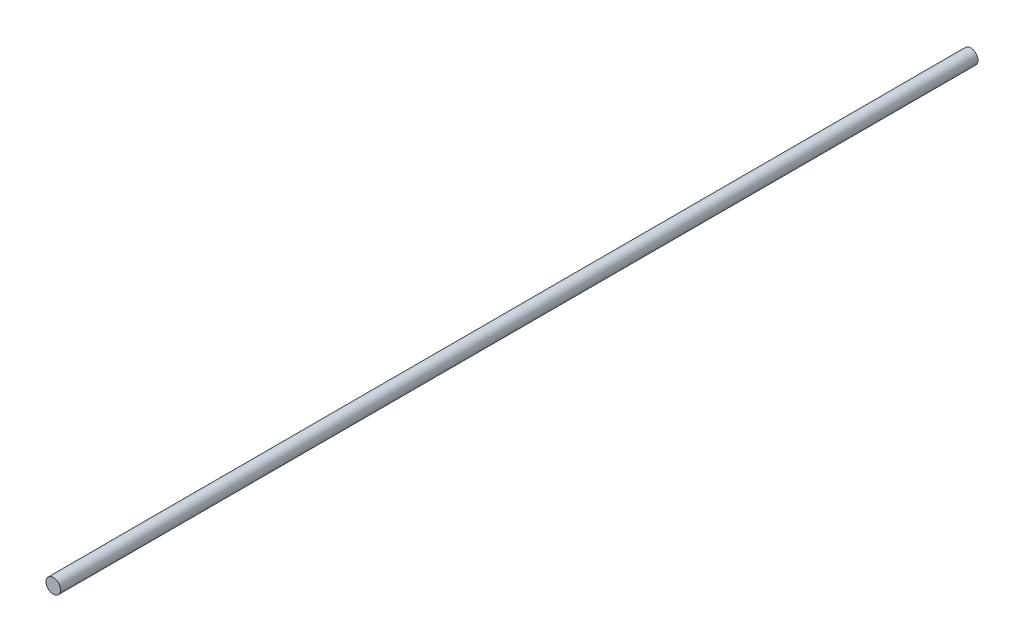
ISO-10303-21;
HEADER;
FILE_DESCRIPTION(('STEP AP214'),'2;1');
FILE_NAME('part.step','',(''),(''),'','','');
FILE_SCHEMA(('AUTOMOTIVE_DESIGN { 1 0 10303 214 1 1 1 1 }'));
ENDSEC;
DATA;
#1=APPLICATION_CONTEXT('core data for automotive mechanical design processes');
#2=APPLICATION_PROTOCOL_DEFINITION('international standard','automotive_design',2000,#1);
#3=PRODUCT_CONTEXT('',#1,'mechanical');
#4=PRODUCT('Part','Part','',(#3));
#5=PRODUCT_RELATED_PRODUCT_CATEGORY('part','',(#4));
#6=PRODUCT_DEFINITION_FORMATION('','',#4);
#7=PRODUCT_DEFINITION_CONTEXT('part definition',#1,'design');
#8=PRODUCT_DEFINITION('design','',#6,#7);
#9=PRODUCT_DEFINITION_SHAPE('','',#8);
#10=(LENGTH_UNIT() NAMED_UNIT(*) SI_UNIT(.MILLI.,.METRE.));
#11=(NAMED_UNIT(*) PLANE_ANGLE_UNIT() SI_UNIT($,.RADIAN.));
#12=(NAMED_UNIT(*) SI_UNIT($,.STERADIAN.) SOLID_ANGLE_UNIT());
#13=UNCERTAINTY_MEASURE_WITH_UNIT(LENGTH_MEASURE(1.E-05),#10,'distance_accuracy_value','');
#14=(GEOMETRIC_REPRESENTATION_CONTEXT(3) GLOBAL_UNCERTAINTY_ASSIGNED_CONTEXT((#13)) GLOBAL_UNIT_ASSIGNED_CONTEXT((#10,
#11,#12)) REPRESENTATION_CONTEXT('',''));
#15=CARTESIAN_POINT('',(0.,0.,0.));
#16=DIRECTION('',(0.,0.,1.));
#17=DIRECTION('',(1.,0.,0.));
#18=AXIS2_PLACEMENT_3D('',#15,#16,#17);
#19=CARTESIAN_POINT('',(0.,0.,380.));
#20=DIRECTION('',(0.,0.,-1.));
#21=DIRECTION('',(-1.,0.,0.));
#22=AXIS2_PLACEMENT_3D('',#19,#20,#21);
#23=CYLINDRICAL_SURFACE('',#22,3.);
#24=CARTESIAN_POINT('',(0.,0.,380.));
#25=DIRECTION('',(0.,0.,1.));
#26=DIRECTION('',(1.,0.,0.));
#27=AXIS2_PLACEMENT_3D('',#24,#25,#26);
#28=CIRCLE('',#27,3.);
#29=CARTESIAN_POINT('',(3.,0.,380.));
#30=VERTEX_POINT('',#29);
#31=EDGE_CURVE('E10',#30,#30,#28,.T.);
#32=ORIENTED_EDGE('',*,*,#31,.F.);
#33=EDGE_LOOP('',(#32));
#34=FACE_BOUND('',#33,.T.);
#35=CARTESIAN_POINT('',(0.,0.,0.));
#36=DIRECTION('',(0.,0.,1.));
#37=DIRECTION('',(1.,0.,0.));
#38=AXIS2_PLACEMENT_3D('',#35,#36,#37);
#39=CIRCLE('',#38,3.);
#40=CARTESIAN_POINT('',(3.,0.,0.));
#41=VERTEX_POINT('',#40);
#42=EDGE_CURVE('E40',#41,#41,#39,.T.);
#43=ORIENTED_EDGE('',*,*,#42,.T.);
#44=EDGE_LOOP('',(#43));
#45=FACE_BOUND('',#44,.T.);
#46=ADVANCED_FACE('F37',(#34,#45),#23,.T.);
#47=CARTESIAN_POINT('',(0.,0.,380.));
#48=DIRECTION('',(0.,0.,1.));
#49=DIRECTION('',(1.,0.,0.));
#50=AXIS2_PLACEMENT_3D('',#47,#48,#49);
#51=PLANE('',#50);
#52=ORIENTED_EDGE('',*,*,#31,.T.);
#53=EDGE_LOOP('',(#52));
#54=FACE_BOUND('',#53,.T.);
#55=ADVANCED_FACE('F52',(#54),#51,.T.);
#56=CARTESIAN_POINT('',(0.,0.,0.));
#57=DIRECTION('',(0.,0.,1.));
#58=DIRECTION('',(1.,0.,0.));
#59=AXIS2_PLACEMENT_3D('',#56,#57,#58);
#60=PLANE('',#59);
#61=ORIENTED_EDGE('',*,*,#42,.F.);
#62=EDGE_LOOP('',(#61));
#63=FACE_BOUND('',#62,.T.);
#64=ADVANCED_FACE('F50',(#63),#60,.F.);
#65=CLOSED_SHELL('',(#46,#55,#64));
#66=MANIFOLD_SOLID_BREP('B2',#65);
#67=ADVANCED_BREP_SHAPE_REPRESENTATION('',(#18,#66),#14);
#68=SHAPE_DEFINITION_REPRESENTATION(#9,#67);
ENDSEC;
END-ISO-10303-21;
